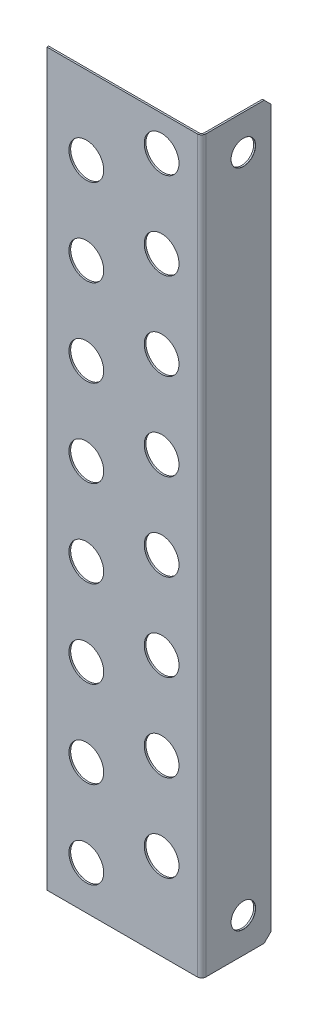
ISO-10303-21;
HEADER;
FILE_DESCRIPTION(('STEP AP214'),'2;1');
FILE_NAME('part.step','',(''),(''),'','','');
FILE_SCHEMA(('AUTOMOTIVE_DESIGN { 1 0 10303 214 1 1 1 1 }'));
ENDSEC;
DATA;
#1=APPLICATION_CONTEXT('core data for automotive mechanical design processes');
#2=APPLICATION_PROTOCOL_DEFINITION('international standard','automotive_design',2000,#1);
#3=PRODUCT_CONTEXT('',#1,'mechanical');
#4=PRODUCT('Part','Part','',(#3));
#5=PRODUCT_RELATED_PRODUCT_CATEGORY('part','',(#4));
#6=PRODUCT_DEFINITION_FORMATION('','',#4);
#7=PRODUCT_DEFINITION_CONTEXT('part definition',#1,'design');
#8=PRODUCT_DEFINITION('design','',#6,#7);
#9=PRODUCT_DEFINITION_SHAPE('','',#8);
#10=(LENGTH_UNIT() NAMED_UNIT(*) SI_UNIT(.MILLI.,.METRE.));
#11=(NAMED_UNIT(*) PLANE_ANGLE_UNIT() SI_UNIT($,.RADIAN.));
#12=(NAMED_UNIT(*) SI_UNIT($,.STERADIAN.) SOLID_ANGLE_UNIT());
#13=UNCERTAINTY_MEASURE_WITH_UNIT(LENGTH_MEASURE(1.E-05),#10,'distance_accuracy_value','');
#14=(GEOMETRIC_REPRESENTATION_CONTEXT(3) GLOBAL_UNCERTAINTY_ASSIGNED_CONTEXT((#13)) GLOBAL_UNIT_ASSIGNED_CONTEXT((#10,
#11,#12)) REPRESENTATION_CONTEXT('',''));
#15=CARTESIAN_POINT('',(0.,0.,0.));
#16=DIRECTION('',(0.,0.,1.));
#17=DIRECTION('',(1.,0.,0.));
#18=AXIS2_PLACEMENT_3D('',#15,#16,#17);
#19=CARTESIAN_POINT('',(22.,-105.,-0.5));
#20=DIRECTION('',(0.,-1.,0.));
#21=DIRECTION('',(1.,0.,0.));
#22=AXIS2_PLACEMENT_3D('',#19,#20,#21);
#23=PLANE('',#22);
#24=DIRECTION('',(1.,0.,0.));
#25=VECTOR('',#24,1.);
#26=CARTESIAN_POINT('',(22.,-105.,-0.5));
#27=LINE('',#26,#25);
#28=CARTESIAN_POINT('',(-22.,-105.,-0.5));
#29=VERTEX_POINT('',#28);
#30=CARTESIAN_POINT('',(21.2634,-105.,-0.500000000000001));
#31=VERTEX_POINT('',#30);
#32=EDGE_CURVE('E213',#29,#31,#27,.T.);
#33=ORIENTED_EDGE('',*,*,#32,.T.);
#34=DIRECTION('',(0.,0.,1.));
#35=VECTOR('',#34,1.);
#36=CARTESIAN_POINT('',(21.2634,-105.,-0.500000000000001));
#37=LINE('',#36,#35);
#38=CARTESIAN_POINT('',(21.2634,-105.,0.));
#39=VERTEX_POINT('',#38);
#40=EDGE_CURVE('E174',#31,#39,#37,.T.);
#41=ORIENTED_EDGE('',*,*,#40,.T.);
#42=DIRECTION('',(1.,0.,0.));
#43=VECTOR('',#42,1.);
#44=CARTESIAN_POINT('',(22.,-105.,0.));
#45=LINE('',#44,#43);
#46=CARTESIAN_POINT('',(-22.,-105.,0.));
#47=VERTEX_POINT('',#46);
#48=EDGE_CURVE('E222',#47,#39,#45,.T.);
#49=ORIENTED_EDGE('',*,*,#48,.F.);
#50=DIRECTION('',(0.,0.,1.));
#51=VECTOR('',#50,1.);
#52=CARTESIAN_POINT('',(-22.,-105.,-0.5));
#53=LINE('',#52,#51);
#54=EDGE_CURVE('E219',#29,#47,#53,.T.);
#55=ORIENTED_EDGE('',*,*,#54,.F.);
#56=EDGE_LOOP('',(#33,#41,#49,#55));
#57=FACE_BOUND('',#56,.T.);
#58=ADVANCED_FACE('F47',(#57),#23,.T.);
#59=CARTESIAN_POINT('',(0.,0.,-0.5));
#60=DIRECTION('',(0.,0.,1.));
#61=DIRECTION('',(1.,0.,0.));
#62=AXIS2_PLACEMENT_3D('',#59,#60,#61);
#63=PLANE('',#62);
#64=CARTESIAN_POINT('',(-10.650635094611,-92.5,-0.5));
#65=DIRECTION('',(0.,0.,1.));
#66=DIRECTION('',(1.,0.,0.));
#67=AXIS2_PLACEMENT_3D('',#64,#65,#66);
#68=CIRCLE('',#67,5.);
#69=CARTESIAN_POINT('',(-5.65063509461096,-92.5,-0.5));
#70=VERTEX_POINT('',#69);
#71=EDGE_CURVE('E299',#70,#70,#68,.T.);
#72=ORIENTED_EDGE('',*,*,#71,.T.);
#73=EDGE_LOOP('',(#72));
#74=FACE_BOUND('',#73,.T.);
#75=CARTESIAN_POINT('',(-10.650635094611,-67.5,-0.5));
#76=DIRECTION('',(0.,0.,1.));
#77=DIRECTION('',(1.,0.,0.));
#78=AXIS2_PLACEMENT_3D('',#75,#76,#77);
#79=CIRCLE('',#78,5.);
#80=CARTESIAN_POINT('',(-5.65063509461096,-67.5,-0.5));
#81=VERTEX_POINT('',#80);
#82=EDGE_CURVE('E293',#81,#81,#79,.T.);
#83=ORIENTED_EDGE('',*,*,#82,.T.);
#84=EDGE_LOOP('',(#83));
#85=FACE_BOUND('',#84,.T.);
#86=CARTESIAN_POINT('',(-10.650635094611,-42.5,-0.5));
#87=DIRECTION('',(0.,0.,1.));
#88=DIRECTION('',(1.,0.,0.));
#89=AXIS2_PLACEMENT_3D('',#86,#87,#88);
#90=CIRCLE('',#89,5.);
#91=CARTESIAN_POINT('',(-5.65063509461096,-42.5,-0.5));
#92=VERTEX_POINT('',#91);
#93=EDGE_CURVE('E287',#92,#92,#90,.T.);
#94=ORIENTED_EDGE('',*,*,#93,.T.);
#95=EDGE_LOOP('',(#94));
#96=FACE_BOUND('',#95,.T.);
#97=CARTESIAN_POINT('',(-10.650635094611,-17.5,-0.5));
#98=DIRECTION('',(0.,0.,1.));
#99=DIRECTION('',(1.,0.,0.));
#100=AXIS2_PLACEMENT_3D('',#97,#98,#99);
#101=CIRCLE('',#100,5.);
#102=CARTESIAN_POINT('',(-5.65063509461096,-17.5,-0.5));
#103=VERTEX_POINT('',#102);
#104=EDGE_CURVE('E281',#103,#103,#101,.T.);
#105=ORIENTED_EDGE('',*,*,#104,.T.);
#106=EDGE_LOOP('',(#105));
#107=FACE_BOUND('',#106,.T.);
#108=CARTESIAN_POINT('',(-10.650635094611,7.50000000000001,-0.5));
#109=DIRECTION('',(0.,0.,1.));
#110=DIRECTION('',(1.,0.,0.));
#111=AXIS2_PLACEMENT_3D('',#108,#109,#110);
#112=CIRCLE('',#111,5.);
#113=CARTESIAN_POINT('',(-5.65063509461096,7.50000000000001,-0.5));
#114=VERTEX_POINT('',#113);
#115=EDGE_CURVE('E275',#114,#114,#112,.T.);
#116=ORIENTED_EDGE('',*,*,#115,.T.);
#117=EDGE_LOOP('',(#116));
#118=FACE_BOUND('',#117,.T.);
#119=CARTESIAN_POINT('',(-10.650635094611,32.5,-0.5));
#120=DIRECTION('',(0.,0.,1.));
#121=DIRECTION('',(1.,0.,0.));
#122=AXIS2_PLACEMENT_3D('',#119,#120,#121);
#123=CIRCLE('',#122,5.);
#124=CARTESIAN_POINT('',(-5.65063509461096,32.5,-0.5));
#125=VERTEX_POINT('',#124);
#126=EDGE_CURVE('E269',#125,#125,#123,.T.);
#127=ORIENTED_EDGE('',*,*,#126,.T.);
#128=EDGE_LOOP('',(#127));
#129=FACE_BOUND('',#128,.T.);
#130=CARTESIAN_POINT('',(11.,-80.,-0.5));
#131=DIRECTION('',(0.,0.,1.));
#132=DIRECTION('',(1.,0.,0.));
#133=AXIS2_PLACEMENT_3D('',#130,#131,#132);
#134=CIRCLE('',#133,5.);
#135=CARTESIAN_POINT('',(16.,-80.,-0.5));
#136=VERTEX_POINT('',#135);
#137=EDGE_CURVE('E263',#136,#136,#134,.T.);
#138=ORIENTED_EDGE('',*,*,#137,.T.);
#139=EDGE_LOOP('',(#138));
#140=FACE_BOUND('',#139,.T.);
#141=CARTESIAN_POINT('',(11.,-55.,-0.5));
#142=DIRECTION('',(0.,0.,1.));
#143=DIRECTION('',(1.,0.,0.));
#144=AXIS2_PLACEMENT_3D('',#141,#142,#143);
#145=CIRCLE('',#144,5.);
#146=CARTESIAN_POINT('',(16.,-55.,-0.5));
#147=VERTEX_POINT('',#146);
#148=EDGE_CURVE('E257',#147,#147,#145,.T.);
#149=ORIENTED_EDGE('',*,*,#148,.T.);
#150=EDGE_LOOP('',(#149));
#151=FACE_BOUND('',#150,.T.);
#152=CARTESIAN_POINT('',(11.,-30.,-0.5));
#153=DIRECTION('',(0.,0.,1.));
#154=DIRECTION('',(1.,0.,0.));
#155=AXIS2_PLACEMENT_3D('',#152,#153,#154);
#156=CIRCLE('',#155,5.);
#157=CARTESIAN_POINT('',(16.,-30.,-0.5));
#158=VERTEX_POINT('',#157);
#159=EDGE_CURVE('E251',#158,#158,#156,.T.);
#160=ORIENTED_EDGE('',*,*,#159,.T.);
#161=EDGE_LOOP('',(#160));
#162=FACE_BOUND('',#161,.T.);
#163=CARTESIAN_POINT('',(11.,-5.,-0.5));
#164=DIRECTION('',(0.,0.,1.));
#165=DIRECTION('',(1.,0.,0.));
#166=AXIS2_PLACEMENT_3D('',#163,#164,#165);
#167=CIRCLE('',#166,5.);
#168=CARTESIAN_POINT('',(16.,-5.,-0.5));
#169=VERTEX_POINT('',#168);
#170=EDGE_CURVE('E245',#169,#169,#167,.T.);
#171=ORIENTED_EDGE('',*,*,#170,.T.);
#172=EDGE_LOOP('',(#171));
#173=FACE_BOUND('',#172,.T.);
#174=CARTESIAN_POINT('',(11.,20.,-0.5));
#175=DIRECTION('',(0.,0.,1.));
#176=DIRECTION('',(1.,0.,0.));
#177=AXIS2_PLACEMENT_3D('',#174,#175,#176);
#178=CIRCLE('',#177,5.);
#179=CARTESIAN_POINT('',(16.,20.,-0.5));
#180=VERTEX_POINT('',#179);
#181=EDGE_CURVE('E239',#180,#180,#178,.T.);
#182=ORIENTED_EDGE('',*,*,#181,.T.);
#183=EDGE_LOOP('',(#182));
#184=FACE_BOUND('',#183,.T.);
#185=CARTESIAN_POINT('',(11.,45.,-0.5));
#186=DIRECTION('',(0.,0.,1.));
#187=DIRECTION('',(1.,0.,0.));
#188=AXIS2_PLACEMENT_3D('',#185,#186,#187);
#189=CIRCLE('',#188,5.);
#190=CARTESIAN_POINT('',(16.,45.,-0.5));
#191=VERTEX_POINT('',#190);
#192=EDGE_CURVE('E233',#191,#191,#189,.T.);
#193=ORIENTED_EDGE('',*,*,#192,.T.);
#194=EDGE_LOOP('',(#193));
#195=FACE_BOUND('',#194,.T.);
#196=CARTESIAN_POINT('',(-10.650635094611,82.5,-0.5));
#197=DIRECTION('',(0.,0.,1.));
#198=DIRECTION('',(1.,0.,0.));
#199=AXIS2_PLACEMENT_3D('',#196,#197,#198);
#200=CIRCLE('',#199,5.);
#201=CARTESIAN_POINT('',(-5.65063509461096,82.5,-0.5));
#202=VERTEX_POINT('',#201);
#203=EDGE_CURVE('E201',#202,#202,#200,.T.);
#204=ORIENTED_EDGE('',*,*,#203,.T.);
#205=EDGE_LOOP('',(#204));
#206=FACE_BOUND('',#205,.T.);
#207=CARTESIAN_POINT('',(11.,95.,-0.5));
#208=DIRECTION('',(0.,0.,1.));
#209=DIRECTION('',(1.,0.,0.));
#210=AXIS2_PLACEMENT_3D('',#207,#208,#209);
#211=CIRCLE('',#210,5.);
#212=CARTESIAN_POINT('',(16.,95.,-0.5));
#213=VERTEX_POINT('',#212);
#214=EDGE_CURVE('E206',#213,#213,#211,.T.);
#215=ORIENTED_EDGE('',*,*,#214,.T.);
#216=EDGE_LOOP('',(#215));
#217=FACE_BOUND('',#216,.T.);
#218=CARTESIAN_POINT('',(11.,70.,-0.5));
#219=DIRECTION('',(0.,0.,1.));
#220=DIRECTION('',(1.,0.,0.));
#221=AXIS2_PLACEMENT_3D('',#218,#219,#220);
#222=CIRCLE('',#221,5.);
#223=CARTESIAN_POINT('',(16.,70.,-0.5));
#224=VERTEX_POINT('',#223);
#225=EDGE_CURVE('E194',#224,#224,#222,.T.);
#226=ORIENTED_EDGE('',*,*,#225,.T.);
#227=EDGE_LOOP('',(#226));
#228=FACE_BOUND('',#227,.T.);
#229=CARTESIAN_POINT('',(-10.650635094611,57.5,-0.5));
#230=DIRECTION('',(0.,0.,1.));
#231=DIRECTION('',(1.,0.,0.));
#232=AXIS2_PLACEMENT_3D('',#229,#230,#231);
#233=CIRCLE('',#232,5.);
#234=CARTESIAN_POINT('',(-5.65063509461096,57.5,-0.5));
#235=VERTEX_POINT('',#234);
#236=EDGE_CURVE('E188',#235,#235,#233,.T.);
#237=ORIENTED_EDGE('',*,*,#236,.T.);
#238=EDGE_LOOP('',(#237));
#239=FACE_BOUND('',#238,.T.);
#240=DIRECTION('',(0.,-1.,0.));
#241=VECTOR('',#240,1.);
#242=CARTESIAN_POINT('',(21.2634,-105.,-0.500000000000001));
#243=LINE('',#242,#241);
#244=CARTESIAN_POINT('',(21.2634,105.,-0.500000000000001));
#245=VERTEX_POINT('',#244);
#246=EDGE_CURVE('E178',#31,#245,#243,.F.);
#247=ORIENTED_EDGE('',*,*,#246,.F.);
#248=ORIENTED_EDGE('',*,*,#32,.F.);
#249=DIRECTION('',(0.,-1.,0.));
#250=VECTOR('',#249,1.);
#251=CARTESIAN_POINT('',(-22.,-105.,-0.5));
#252=LINE('',#251,#250);
#253=CARTESIAN_POINT('',(-22.,105.,-0.5));
#254=VERTEX_POINT('',#253);
#255=EDGE_CURVE('E210',#254,#29,#252,.T.);
#256=ORIENTED_EDGE('',*,*,#255,.F.);
#257=DIRECTION('',(-1.,0.,0.));
#258=VECTOR('',#257,1.);
#259=CARTESIAN_POINT('',(22.,105.,-0.5));
#260=LINE('',#259,#258);
#261=EDGE_CURVE('E217',#245,#254,#260,.T.);
#262=ORIENTED_EDGE('',*,*,#261,.F.);
#263=EDGE_LOOP('',(#247,#248,#256,#262));
#264=FACE_BOUND('',#263,.T.);
#265=ADVANCED_FACE('F369',(#74,#85,#96,#107,#118,#129,#140,#151,#162,#173,#184,#195,#206,#217,
#228,#239,#264),#63,.F.);
#266=CARTESIAN_POINT('',(0.,0.,0.));
#267=DIRECTION('',(0.,0.,1.));
#268=DIRECTION('',(1.,0.,0.));
#269=AXIS2_PLACEMENT_3D('',#266,#267,#268);
#270=PLANE('',#269);
#271=CARTESIAN_POINT('',(-10.650635094611,57.5,0.));
#272=DIRECTION('',(0.,0.,1.));
#273=DIRECTION('',(1.,0.,0.));
#274=AXIS2_PLACEMENT_3D('',#271,#272,#273);
#275=CIRCLE('',#274,5.);
#276=CARTESIAN_POINT('',(-5.65063509461096,57.5,0.));
#277=VERTEX_POINT('',#276);
#278=EDGE_CURVE('E184',#277,#277,#275,.T.);
#279=ORIENTED_EDGE('',*,*,#278,.F.);
#280=EDGE_LOOP('',(#279));
#281=FACE_BOUND('',#280,.T.);
#282=CARTESIAN_POINT('',(11.,70.,0.));
#283=DIRECTION('',(0.,0.,1.));
#284=DIRECTION('',(1.,0.,0.));
#285=AXIS2_PLACEMENT_3D('',#282,#283,#284);
#286=CIRCLE('',#285,5.);
#287=CARTESIAN_POINT('',(16.,70.,0.));
#288=VERTEX_POINT('',#287);
#289=EDGE_CURVE('E191',#288,#288,#286,.T.);
#290=ORIENTED_EDGE('',*,*,#289,.F.);
#291=EDGE_LOOP('',(#290));
#292=FACE_BOUND('',#291,.T.);
#293=CARTESIAN_POINT('',(11.,95.,0.));
#294=DIRECTION('',(0.,0.,1.));
#295=DIRECTION('',(1.,0.,0.));
#296=AXIS2_PLACEMENT_3D('',#293,#294,#295);
#297=CIRCLE('',#296,5.);
#298=CARTESIAN_POINT('',(16.,95.,0.));
#299=VERTEX_POINT('',#298);
#300=EDGE_CURVE('E198',#299,#299,#297,.T.);
#301=ORIENTED_EDGE('',*,*,#300,.F.);
#302=EDGE_LOOP('',(#301));
#303=FACE_BOUND('',#302,.T.);
#304=CARTESIAN_POINT('',(-10.650635094611,82.5,0.));
#305=DIRECTION('',(0.,0.,1.));
#306=DIRECTION('',(1.,0.,0.));
#307=AXIS2_PLACEMENT_3D('',#304,#305,#306);
#308=CIRCLE('',#307,5.);
#309=CARTESIAN_POINT('',(-5.65063509461096,82.5,0.));
#310=VERTEX_POINT('',#309);
#311=EDGE_CURVE('E197',#310,#310,#308,.T.);
#312=ORIENTED_EDGE('',*,*,#311,.F.);
#313=EDGE_LOOP('',(#312));
#314=FACE_BOUND('',#313,.T.);
#315=CARTESIAN_POINT('',(11.,45.,0.));
#316=DIRECTION('',(0.,0.,1.));
#317=DIRECTION('',(1.,0.,0.));
#318=AXIS2_PLACEMENT_3D('',#315,#316,#317);
#319=CIRCLE('',#318,5.);
#320=CARTESIAN_POINT('',(16.,45.,0.));
#321=VERTEX_POINT('',#320);
#322=EDGE_CURVE('E229',#321,#321,#319,.T.);
#323=ORIENTED_EDGE('',*,*,#322,.F.);
#324=EDGE_LOOP('',(#323));
#325=FACE_BOUND('',#324,.T.);
#326=CARTESIAN_POINT('',(11.,20.,0.));
#327=DIRECTION('',(0.,0.,1.));
#328=DIRECTION('',(1.,0.,0.));
#329=AXIS2_PLACEMENT_3D('',#326,#327,#328);
#330=CIRCLE('',#329,5.);
#331=CARTESIAN_POINT('',(16.,20.,0.));
#332=VERTEX_POINT('',#331);
#333=EDGE_CURVE('E236',#332,#332,#330,.T.);
#334=ORIENTED_EDGE('',*,*,#333,.F.);
#335=EDGE_LOOP('',(#334));
#336=FACE_BOUND('',#335,.T.);
#337=CARTESIAN_POINT('',(11.,-5.,0.));
#338=DIRECTION('',(0.,0.,1.));
#339=DIRECTION('',(1.,0.,0.));
#340=AXIS2_PLACEMENT_3D('',#337,#338,#339);
#341=CIRCLE('',#340,5.);
#342=CARTESIAN_POINT('',(16.,-5.,0.));
#343=VERTEX_POINT('',#342);
#344=EDGE_CURVE('E242',#343,#343,#341,.T.);
#345=ORIENTED_EDGE('',*,*,#344,.F.);
#346=EDGE_LOOP('',(#345));
#347=FACE_BOUND('',#346,.T.);
#348=CARTESIAN_POINT('',(11.,-30.,0.));
#349=DIRECTION('',(0.,0.,1.));
#350=DIRECTION('',(1.,0.,0.));
#351=AXIS2_PLACEMENT_3D('',#348,#349,#350);
#352=CIRCLE('',#351,5.);
#353=CARTESIAN_POINT('',(16.,-30.,0.));
#354=VERTEX_POINT('',#353);
#355=EDGE_CURVE('E248',#354,#354,#352,.T.);
#356=ORIENTED_EDGE('',*,*,#355,.F.);
#357=EDGE_LOOP('',(#356));
#358=FACE_BOUND('',#357,.T.);
#359=CARTESIAN_POINT('',(11.,-55.,0.));
#360=DIRECTION('',(0.,0.,1.));
#361=DIRECTION('',(1.,0.,0.));
#362=AXIS2_PLACEMENT_3D('',#359,#360,#361);
#363=CIRCLE('',#362,5.);
#364=CARTESIAN_POINT('',(16.,-55.,0.));
#365=VERTEX_POINT('',#364);
#366=EDGE_CURVE('E254',#365,#365,#363,.T.);
#367=ORIENTED_EDGE('',*,*,#366,.F.);
#368=EDGE_LOOP('',(#367));
#369=FACE_BOUND('',#368,.T.);
#370=CARTESIAN_POINT('',(11.,-80.,0.));
#371=DIRECTION('',(0.,0.,1.));
#372=DIRECTION('',(1.,0.,0.));
#373=AXIS2_PLACEMENT_3D('',#370,#371,#372);
#374=CIRCLE('',#373,5.);
#375=CARTESIAN_POINT('',(16.,-80.,0.));
#376=VERTEX_POINT('',#375);
#377=EDGE_CURVE('E260',#376,#376,#374,.T.);
#378=ORIENTED_EDGE('',*,*,#377,.F.);
#379=EDGE_LOOP('',(#378));
#380=FACE_BOUND('',#379,.T.);
#381=CARTESIAN_POINT('',(-10.650635094611,32.5,0.));
#382=DIRECTION('',(0.,0.,1.));
#383=DIRECTION('',(1.,0.,0.));
#384=AXIS2_PLACEMENT_3D('',#381,#382,#383);
#385=CIRCLE('',#384,5.);
#386=CARTESIAN_POINT('',(-5.65063509461096,32.5,0.));
#387=VERTEX_POINT('',#386);
#388=EDGE_CURVE('E266',#387,#387,#385,.T.);
#389=ORIENTED_EDGE('',*,*,#388,.F.);
#390=EDGE_LOOP('',(#389));
#391=FACE_BOUND('',#390,.T.);
#392=CARTESIAN_POINT('',(-10.650635094611,7.50000000000001,0.));
#393=DIRECTION('',(0.,0.,1.));
#394=DIRECTION('',(1.,0.,0.));
#395=AXIS2_PLACEMENT_3D('',#392,#393,#394);
#396=CIRCLE('',#395,5.);
#397=CARTESIAN_POINT('',(-5.65063509461096,7.50000000000001,0.));
#398=VERTEX_POINT('',#397);
#399=EDGE_CURVE('E272',#398,#398,#396,.T.);
#400=ORIENTED_EDGE('',*,*,#399,.F.);
#401=EDGE_LOOP('',(#400));
#402=FACE_BOUND('',#401,.T.);
#403=CARTESIAN_POINT('',(-10.650635094611,-17.5,0.));
#404=DIRECTION('',(0.,0.,1.));
#405=DIRECTION('',(1.,0.,0.));
#406=AXIS2_PLACEMENT_3D('',#403,#404,#405);
#407=CIRCLE('',#406,5.);
#408=CARTESIAN_POINT('',(-5.65063509461096,-17.5,0.));
#409=VERTEX_POINT('',#408);
#410=EDGE_CURVE('E278',#409,#409,#407,.T.);
#411=ORIENTED_EDGE('',*,*,#410,.F.);
#412=EDGE_LOOP('',(#411));
#413=FACE_BOUND('',#412,.T.);
#414=CARTESIAN_POINT('',(-10.650635094611,-42.5,0.));
#415=DIRECTION('',(0.,0.,1.));
#416=DIRECTION('',(1.,0.,0.));
#417=AXIS2_PLACEMENT_3D('',#414,#415,#416);
#418=CIRCLE('',#417,5.);
#419=CARTESIAN_POINT('',(-5.65063509461096,-42.5,0.));
#420=VERTEX_POINT('',#419);
#421=EDGE_CURVE('E284',#420,#420,#418,.T.);
#422=ORIENTED_EDGE('',*,*,#421,.F.);
#423=EDGE_LOOP('',(#422));
#424=FACE_BOUND('',#423,.T.);
#425=CARTESIAN_POINT('',(-10.650635094611,-67.5,0.));
#426=DIRECTION('',(0.,0.,1.));
#427=DIRECTION('',(1.,0.,0.));
#428=AXIS2_PLACEMENT_3D('',#425,#426,#427);
#429=CIRCLE('',#428,5.);
#430=CARTESIAN_POINT('',(-5.65063509461096,-67.5,0.));
#431=VERTEX_POINT('',#430);
#432=EDGE_CURVE('E290',#431,#431,#429,.T.);
#433=ORIENTED_EDGE('',*,*,#432,.F.);
#434=EDGE_LOOP('',(#433));
#435=FACE_BOUND('',#434,.T.);
#436=CARTESIAN_POINT('',(-10.650635094611,-92.5,0.));
#437=DIRECTION('',(0.,0.,1.));
#438=DIRECTION('',(1.,0.,0.));
#439=AXIS2_PLACEMENT_3D('',#436,#437,#438);
#440=CIRCLE('',#439,5.);
#441=CARTESIAN_POINT('',(-5.65063509461096,-92.5,0.));
#442=VERTEX_POINT('',#441);
#443=EDGE_CURVE('E296',#442,#442,#440,.T.);
#444=ORIENTED_EDGE('',*,*,#443,.F.);
#445=EDGE_LOOP('',(#444));
#446=FACE_BOUND('',#445,.T.);
#447=ORIENTED_EDGE('',*,*,#48,.T.);
#448=DIRECTION('',(0.,-1.,0.));
#449=VECTOR('',#448,1.);
#450=CARTESIAN_POINT('',(21.2634,-105.,0.));
#451=LINE('',#450,#449);
#452=CARTESIAN_POINT('',(21.2634,105.,0.));
#453=VERTEX_POINT('',#452);
#454=EDGE_CURVE('E132',#39,#453,#451,.F.);
#455=ORIENTED_EDGE('',*,*,#454,.T.);
#456=DIRECTION('',(-1.,0.,0.));
#457=VECTOR('',#456,1.);
#458=CARTESIAN_POINT('',(22.,105.,0.));
#459=LINE('',#458,#457);
#460=CARTESIAN_POINT('',(-22.,105.,0.));
#461=VERTEX_POINT('',#460);
#462=EDGE_CURVE('E214',#453,#461,#459,.T.);
#463=ORIENTED_EDGE('',*,*,#462,.T.);
#464=DIRECTION('',(0.,-1.,0.));
#465=VECTOR('',#464,1.);
#466=CARTESIAN_POINT('',(-22.,-105.,0.));
#467=LINE('',#466,#465);
#468=EDGE_CURVE('E209',#461,#47,#467,.T.);
#469=ORIENTED_EDGE('',*,*,#468,.T.);
#470=EDGE_LOOP('',(#447,#455,#463,#469));
#471=FACE_BOUND('',#470,.T.);
#472=ADVANCED_FACE('F376',(#281,#292,#303,#314,#325,#336,#347,#358,#369,#380,#391,#402,#413,
#424,#435,#446,#471),#270,.T.);
#473=CARTESIAN_POINT('',(-10.650635094611,-92.5,-10.));
#474=DIRECTION('',(0.,0.,1.));
#475=DIRECTION('',(1.,0.,0.));
#476=AXIS2_PLACEMENT_3D('',#473,#474,#475);
#477=CYLINDRICAL_SURFACE('',#476,5.);
#478=ORIENTED_EDGE('',*,*,#443,.T.);
#479=EDGE_LOOP('',(#478));
#480=FACE_BOUND('',#479,.T.);
#481=ORIENTED_EDGE('',*,*,#71,.F.);
#482=EDGE_LOOP('',(#481));
#483=FACE_BOUND('',#482,.T.);
#484=ADVANCED_FACE('F430',(#480,#483),#477,.F.);
#485=CARTESIAN_POINT('',(-10.650635094611,-67.5,-10.));
#486=DIRECTION('',(0.,0.,1.));
#487=DIRECTION('',(1.,0.,0.));
#488=AXIS2_PLACEMENT_3D('',#485,#486,#487);
#489=CYLINDRICAL_SURFACE('',#488,5.);
#490=ORIENTED_EDGE('',*,*,#432,.T.);
#491=EDGE_LOOP('',(#490));
#492=FACE_BOUND('',#491,.T.);
#493=ORIENTED_EDGE('',*,*,#82,.F.);
#494=EDGE_LOOP('',(#493));
#495=FACE_BOUND('',#494,.T.);
#496=ADVANCED_FACE('F426',(#492,#495),#489,.F.);
#497=CARTESIAN_POINT('',(-10.650635094611,-42.5,-10.));
#498=DIRECTION('',(0.,0.,1.));
#499=DIRECTION('',(1.,0.,0.));
#500=AXIS2_PLACEMENT_3D('',#497,#498,#499);
#501=CYLINDRICAL_SURFACE('',#500,5.);
#502=ORIENTED_EDGE('',*,*,#421,.T.);
#503=EDGE_LOOP('',(#502));
#504=FACE_BOUND('',#503,.T.);
#505=ORIENTED_EDGE('',*,*,#93,.F.);
#506=EDGE_LOOP('',(#505));
#507=FACE_BOUND('',#506,.T.);
#508=ADVANCED_FACE('F422',(#504,#507),#501,.F.);
#509=CARTESIAN_POINT('',(-10.650635094611,-17.5,-10.));
#510=DIRECTION('',(0.,0.,1.));
#511=DIRECTION('',(1.,0.,0.));
#512=AXIS2_PLACEMENT_3D('',#509,#510,#511);
#513=CYLINDRICAL_SURFACE('',#512,5.);
#514=ORIENTED_EDGE('',*,*,#410,.T.);
#515=EDGE_LOOP('',(#514));
#516=FACE_BOUND('',#515,.T.);
#517=ORIENTED_EDGE('',*,*,#104,.F.);
#518=EDGE_LOOP('',(#517));
#519=FACE_BOUND('',#518,.T.);
#520=ADVANCED_FACE('F418',(#516,#519),#513,.F.);
#521=CARTESIAN_POINT('',(-10.650635094611,7.50000000000001,-10.));
#522=DIRECTION('',(0.,0.,1.));
#523=DIRECTION('',(1.,0.,0.));
#524=AXIS2_PLACEMENT_3D('',#521,#522,#523);
#525=CYLINDRICAL_SURFACE('',#524,5.);
#526=ORIENTED_EDGE('',*,*,#399,.T.);
#527=EDGE_LOOP('',(#526));
#528=FACE_BOUND('',#527,.T.);
#529=ORIENTED_EDGE('',*,*,#115,.F.);
#530=EDGE_LOOP('',(#529));
#531=FACE_BOUND('',#530,.T.);
#532=ADVANCED_FACE('F414',(#528,#531),#525,.F.);
#533=CARTESIAN_POINT('',(-10.650635094611,32.5,-10.));
#534=DIRECTION('',(0.,0.,1.));
#535=DIRECTION('',(1.,0.,0.));
#536=AXIS2_PLACEMENT_3D('',#533,#534,#535);
#537=CYLINDRICAL_SURFACE('',#536,5.);
#538=ORIENTED_EDGE('',*,*,#388,.T.);
#539=EDGE_LOOP('',(#538));
#540=FACE_BOUND('',#539,.T.);
#541=ORIENTED_EDGE('',*,*,#126,.F.);
#542=EDGE_LOOP('',(#541));
#543=FACE_BOUND('',#542,.T.);
#544=ADVANCED_FACE('F410',(#540,#543),#537,.F.);
#545=CARTESIAN_POINT('',(11.,-80.,-10.));
#546=DIRECTION('',(0.,0.,1.));
#547=DIRECTION('',(1.,0.,0.));
#548=AXIS2_PLACEMENT_3D('',#545,#546,#547);
#549=CYLINDRICAL_SURFACE('',#548,5.);
#550=ORIENTED_EDGE('',*,*,#377,.T.);
#551=EDGE_LOOP('',(#550));
#552=FACE_BOUND('',#551,.T.);
#553=ORIENTED_EDGE('',*,*,#137,.F.);
#554=EDGE_LOOP('',(#553));
#555=FACE_BOUND('',#554,.T.);
#556=ADVANCED_FACE('F406',(#552,#555),#549,.F.);
#557=CARTESIAN_POINT('',(11.,-55.,-10.));
#558=DIRECTION('',(0.,0.,1.));
#559=DIRECTION('',(1.,0.,0.));
#560=AXIS2_PLACEMENT_3D('',#557,#558,#559);
#561=CYLINDRICAL_SURFACE('',#560,5.);
#562=ORIENTED_EDGE('',*,*,#366,.T.);
#563=EDGE_LOOP('',(#562));
#564=FACE_BOUND('',#563,.T.);
#565=ORIENTED_EDGE('',*,*,#148,.F.);
#566=EDGE_LOOP('',(#565));
#567=FACE_BOUND('',#566,.T.);
#568=ADVANCED_FACE('F402',(#564,#567),#561,.F.);
#569=CARTESIAN_POINT('',(11.,-30.,-10.));
#570=DIRECTION('',(0.,0.,1.));
#571=DIRECTION('',(1.,0.,0.));
#572=AXIS2_PLACEMENT_3D('',#569,#570,#571);
#573=CYLINDRICAL_SURFACE('',#572,5.);
#574=ORIENTED_EDGE('',*,*,#355,.T.);
#575=EDGE_LOOP('',(#574));
#576=FACE_BOUND('',#575,.T.);
#577=ORIENTED_EDGE('',*,*,#159,.F.);
#578=EDGE_LOOP('',(#577));
#579=FACE_BOUND('',#578,.T.);
#580=ADVANCED_FACE('F398',(#576,#579),#573,.F.);
#581=CARTESIAN_POINT('',(11.,-5.,-10.));
#582=DIRECTION('',(0.,0.,1.));
#583=DIRECTION('',(1.,0.,0.));
#584=AXIS2_PLACEMENT_3D('',#581,#582,#583);
#585=CYLINDRICAL_SURFACE('',#584,5.);
#586=ORIENTED_EDGE('',*,*,#344,.T.);
#587=EDGE_LOOP('',(#586));
#588=FACE_BOUND('',#587,.T.);
#589=ORIENTED_EDGE('',*,*,#170,.F.);
#590=EDGE_LOOP('',(#589));
#591=FACE_BOUND('',#590,.T.);
#592=ADVANCED_FACE('F394',(#588,#591),#585,.F.);
#593=CARTESIAN_POINT('',(11.,20.,-10.));
#594=DIRECTION('',(0.,0.,1.));
#595=DIRECTION('',(1.,0.,0.));
#596=AXIS2_PLACEMENT_3D('',#593,#594,#595);
#597=CYLINDRICAL_SURFACE('',#596,5.);
#598=ORIENTED_EDGE('',*,*,#333,.T.);
#599=EDGE_LOOP('',(#598));
#600=FACE_BOUND('',#599,.T.);
#601=ORIENTED_EDGE('',*,*,#181,.F.);
#602=EDGE_LOOP('',(#601));
#603=FACE_BOUND('',#602,.T.);
#604=ADVANCED_FACE('F390',(#600,#603),#597,.F.);
#605=CARTESIAN_POINT('',(11.,45.,-10.));
#606=DIRECTION('',(0.,0.,1.));
#607=DIRECTION('',(1.,0.,0.));
#608=AXIS2_PLACEMENT_3D('',#605,#606,#607);
#609=CYLINDRICAL_SURFACE('',#608,5.);
#610=ORIENTED_EDGE('',*,*,#322,.T.);
#611=EDGE_LOOP('',(#610));
#612=FACE_BOUND('',#611,.T.);
#613=ORIENTED_EDGE('',*,*,#192,.F.);
#614=EDGE_LOOP('',(#613));
#615=FACE_BOUND('',#614,.T.);
#616=ADVANCED_FACE('F386',(#612,#615),#609,.F.);
#617=CARTESIAN_POINT('',(-22.,-105.,-0.5));
#618=DIRECTION('',(-1.,0.,0.));
#619=DIRECTION('',(0.,0.,1.));
#620=AXIS2_PLACEMENT_3D('',#617,#618,#619);
#621=PLANE('',#620);
#622=ORIENTED_EDGE('',*,*,#468,.F.);
#623=DIRECTION('',(0.,0.,1.));
#624=VECTOR('',#623,1.);
#625=CARTESIAN_POINT('',(-22.,105.,-0.5));
#626=LINE('',#625,#624);
#627=EDGE_CURVE('E226',#254,#461,#626,.T.);
#628=ORIENTED_EDGE('',*,*,#627,.F.);
#629=ORIENTED_EDGE('',*,*,#255,.T.);
#630=ORIENTED_EDGE('',*,*,#54,.T.);
#631=EDGE_LOOP('',(#622,#628,#629,#630));
#632=FACE_BOUND('',#631,.T.);
#633=ADVANCED_FACE('F383',(#632),#621,.T.);
#634=CARTESIAN_POINT('',(22.,105.,-0.5));
#635=DIRECTION('',(0.,1.,0.));
#636=DIRECTION('',(0.,0.,1.));
#637=AXIS2_PLACEMENT_3D('',#634,#635,#636);
#638=PLANE('',#637);
#639=DIRECTION('',(0.,0.,1.));
#640=VECTOR('',#639,1.);
#641=CARTESIAN_POINT('',(21.2634,105.,-0.500000000000001));
#642=LINE('',#641,#640);
#643=EDGE_CURVE('E181',#245,#453,#642,.T.);
#644=ORIENTED_EDGE('',*,*,#643,.F.);
#645=ORIENTED_EDGE('',*,*,#261,.T.);
#646=ORIENTED_EDGE('',*,*,#627,.T.);
#647=ORIENTED_EDGE('',*,*,#462,.F.);
#648=EDGE_LOOP('',(#644,#645,#646,#647));
#649=FACE_BOUND('',#648,.T.);
#650=ADVANCED_FACE('F381',(#649),#638,.T.);
#651=CARTESIAN_POINT('',(-10.650635094611,82.5,-10.));
#652=DIRECTION('',(0.,0.,1.));
#653=DIRECTION('',(1.,0.,0.));
#654=AXIS2_PLACEMENT_3D('',#651,#652,#653);
#655=CYLINDRICAL_SURFACE('',#654,5.);
#656=ORIENTED_EDGE('',*,*,#311,.T.);
#657=EDGE_LOOP('',(#656));
#658=FACE_BOUND('',#657,.T.);
#659=ORIENTED_EDGE('',*,*,#203,.F.);
#660=EDGE_LOOP('',(#659));
#661=FACE_BOUND('',#660,.T.);
#662=ADVANCED_FACE('F479',(#658,#661),#655,.F.);
#663=CARTESIAN_POINT('',(11.,95.,-10.));
#664=DIRECTION('',(0.,0.,1.));
#665=DIRECTION('',(1.,0.,0.));
#666=AXIS2_PLACEMENT_3D('',#663,#664,#665);
#667=CYLINDRICAL_SURFACE('',#666,5.);
#668=ORIENTED_EDGE('',*,*,#300,.T.);
#669=EDGE_LOOP('',(#668));
#670=FACE_BOUND('',#669,.T.);
#671=ORIENTED_EDGE('',*,*,#214,.F.);
#672=EDGE_LOOP('',(#671));
#673=FACE_BOUND('',#672,.T.);
#674=ADVANCED_FACE('F475',(#670,#673),#667,.F.);
#675=CARTESIAN_POINT('',(11.,70.,-10.));
#676=DIRECTION('',(0.,0.,1.));
#677=DIRECTION('',(1.,0.,0.));
#678=AXIS2_PLACEMENT_3D('',#675,#676,#677);
#679=CYLINDRICAL_SURFACE('',#678,5.);
#680=ORIENTED_EDGE('',*,*,#289,.T.);
#681=EDGE_LOOP('',(#680));
#682=FACE_BOUND('',#681,.T.);
#683=ORIENTED_EDGE('',*,*,#225,.F.);
#684=EDGE_LOOP('',(#683));
#685=FACE_BOUND('',#684,.T.);
#686=ADVANCED_FACE('F471',(#682,#685),#679,.F.);
#687=CARTESIAN_POINT('',(-10.650635094611,57.5,-10.));
#688=DIRECTION('',(0.,0.,1.));
#689=DIRECTION('',(1.,0.,0.));
#690=AXIS2_PLACEMENT_3D('',#687,#688,#689);
#691=CYLINDRICAL_SURFACE('',#690,5.);
#692=ORIENTED_EDGE('',*,*,#278,.T.);
#693=EDGE_LOOP('',(#692));
#694=FACE_BOUND('',#693,.T.);
#695=ORIENTED_EDGE('',*,*,#236,.F.);
#696=EDGE_LOOP('',(#695));
#697=FACE_BOUND('',#696,.T.);
#698=ADVANCED_FACE('F466',(#694,#697),#691,.F.);
#699=CARTESIAN_POINT('',(21.2634,105.,-1.2366));
#700=DIRECTION('',(0.,1.,0.));
#701=DIRECTION('',(0.,0.,1.));
#702=AXIS2_PLACEMENT_3D('',#699,#700,#701);
#703=PLANE('',#702);
#704=DIRECTION('',(1.,0.,0.));
#705=VECTOR('',#704,1.);
#706=CARTESIAN_POINT('',(22.,105.,-1.2366));
#707=LINE('',#706,#705);
#708=CARTESIAN_POINT('',(22.,105.,-1.2366));
#709=VERTEX_POINT('',#708);
#710=CARTESIAN_POINT('',(22.5,105.,-1.2366));
#711=VERTEX_POINT('',#710);
#712=EDGE_CURVE('E306',#709,#711,#707,.T.);
#713=ORIENTED_EDGE('',*,*,#712,.F.);
#714=CARTESIAN_POINT('',(21.2634,105.,-1.2366));
#715=DIRECTION('',(0.,-1.,0.));
#716=DIRECTION('',(0.,0.,-1.));
#717=AXIS2_PLACEMENT_3D('',#714,#715,#716);
#718=CIRCLE('',#717,0.7366);
#719=EDGE_CURVE('E135',#245,#709,#718,.F.);
#720=ORIENTED_EDGE('',*,*,#719,.F.);
#721=ORIENTED_EDGE('',*,*,#643,.T.);
#722=CARTESIAN_POINT('',(21.2634,105.,-1.2366));
#723=DIRECTION('',(0.,-1.,0.));
#724=DIRECTION('',(0.,0.,-1.));
#725=AXIS2_PLACEMENT_3D('',#722,#723,#724);
#726=CIRCLE('',#725,1.2366);
#727=EDGE_CURVE('E173',#453,#711,#726,.F.);
#728=ORIENTED_EDGE('',*,*,#727,.T.);
#729=EDGE_LOOP('',(#713,#720,#721,#728));
#730=FACE_BOUND('',#729,.T.);
#731=ADVANCED_FACE('F463',(#730),#703,.T.);
#732=CARTESIAN_POINT('',(21.2634,-105.,-1.2366));
#733=DIRECTION('',(0.,1.,0.));
#734=DIRECTION('',(0.,0.,1.));
#735=AXIS2_PLACEMENT_3D('',#732,#733,#734);
#736=PLANE('',#735);
#737=CARTESIAN_POINT('',(21.2634,-105.,-1.2366));
#738=DIRECTION('',(0.,-1.,0.));
#739=DIRECTION('',(0.,0.,-1.));
#740=AXIS2_PLACEMENT_3D('',#737,#738,#739);
#741=CIRCLE('',#740,0.7366);
#742=CARTESIAN_POINT('',(22.,-105.,-1.2366));
#743=VERTEX_POINT('',#742);
#744=EDGE_CURVE('E142',#743,#31,#741,.T.);
#745=ORIENTED_EDGE('',*,*,#744,.F.);
#746=DIRECTION('',(1.,0.,0.));
#747=VECTOR('',#746,1.);
#748=CARTESIAN_POINT('',(22.,-105.,-1.2366));
#749=LINE('',#748,#747);
#750=CARTESIAN_POINT('',(22.5,-105.,-1.2366));
#751=VERTEX_POINT('',#750);
#752=EDGE_CURVE('E139',#743,#751,#749,.T.);
#753=ORIENTED_EDGE('',*,*,#752,.T.);
#754=CARTESIAN_POINT('',(21.2634,-105.,-1.2366));
#755=DIRECTION('',(0.,-1.,0.));
#756=DIRECTION('',(0.,0.,-1.));
#757=AXIS2_PLACEMENT_3D('',#754,#755,#756);
#758=CIRCLE('',#757,1.2366);
#759=EDGE_CURVE('E125',#751,#39,#758,.T.);
#760=ORIENTED_EDGE('',*,*,#759,.T.);
#761=ORIENTED_EDGE('',*,*,#40,.F.);
#762=EDGE_LOOP('',(#745,#753,#760,#761));
#763=FACE_BOUND('',#762,.T.);
#764=ADVANCED_FACE('F140',(#763),#736,.F.);
#765=CARTESIAN_POINT('',(21.2634,-105.,-1.2366));
#766=DIRECTION('',(0.,-1.,0.));
#767=DIRECTION('',(1.,0.,0.));
#768=AXIS2_PLACEMENT_3D('',#765,#766,#767);
#769=CYLINDRICAL_SURFACE('',#768,1.2366);
#770=ORIENTED_EDGE('',*,*,#454,.F.);
#771=ORIENTED_EDGE('',*,*,#759,.F.);
#772=DIRECTION('',(0.,1.,0.));
#773=VECTOR('',#772,1.);
#774=CARTESIAN_POINT('',(22.5,0.,-1.2366));
#775=LINE('',#774,#773);
#776=EDGE_CURVE('E129',#751,#711,#775,.T.);
#777=ORIENTED_EDGE('',*,*,#776,.T.);
#778=ORIENTED_EDGE('',*,*,#727,.F.);
#779=EDGE_LOOP('',(#770,#771,#777,#778));
#780=FACE_BOUND('',#779,.T.);
#781=ADVANCED_FACE('F127',(#780),#769,.T.);
#782=CARTESIAN_POINT('',(21.2634,-105.,-1.2366));
#783=DIRECTION('',(0.,-1.,0.));
#784=DIRECTION('',(1.,0.,0.));
#785=AXIS2_PLACEMENT_3D('',#782,#783,#784);
#786=CYLINDRICAL_SURFACE('',#785,0.7366);
#787=ORIENTED_EDGE('',*,*,#246,.T.);
#788=ORIENTED_EDGE('',*,*,#719,.T.);
#789=DIRECTION('',(0.,-1.,0.));
#790=VECTOR('',#789,1.);
#791=CARTESIAN_POINT('',(22.,105.,-1.2366));
#792=LINE('',#791,#790);
#793=EDGE_CURVE('E147',#709,#743,#792,.T.);
#794=ORIENTED_EDGE('',*,*,#793,.T.);
#795=ORIENTED_EDGE('',*,*,#744,.T.);
#796=EDGE_LOOP('',(#787,#788,#794,#795));
#797=FACE_BOUND('',#796,.T.);
#798=ADVANCED_FACE('F458',(#797),#786,.F.);
#799=CARTESIAN_POINT('',(22.5000000000001,-105.,-20.));
#800=DIRECTION('',(0.,1.,0.));
#801=DIRECTION('',(0.,0.,1.));
#802=AXIS2_PLACEMENT_3D('',#799,#800,#801);
#803=PLANE('',#802);
#804=DIRECTION('',(0.,0.,-1.));
#805=VECTOR('',#804,1.);
#806=CARTESIAN_POINT('',(22.0000000000001,-105.,-20.));
#807=LINE('',#806,#805);
#808=CARTESIAN_POINT('',(22.0000000000001,-105.,-18.));
#809=VERTEX_POINT('',#808);
#810=EDGE_CURVE('E156',#743,#809,#807,.T.);
#811=ORIENTED_EDGE('',*,*,#810,.T.);
#812=DIRECTION('',(1.,0.,0.));
#813=VECTOR('',#812,1.);
#814=CARTESIAN_POINT('',(22.5000000000001,-105.,-18.));
#815=LINE('',#814,#813);
#816=CARTESIAN_POINT('',(22.5000000000001,-105.,-18.));
#817=VERTEX_POINT('',#816);
#818=EDGE_CURVE('E160',#809,#817,#815,.T.);
#819=ORIENTED_EDGE('',*,*,#818,.T.);
#820=DIRECTION('',(0.,0.,-1.));
#821=VECTOR('',#820,1.);
#822=CARTESIAN_POINT('',(22.5000000000001,-105.,-20.));
#823=LINE('',#822,#821);
#824=EDGE_CURVE('E152',#751,#817,#823,.T.);
#825=ORIENTED_EDGE('',*,*,#824,.F.);
#826=ORIENTED_EDGE('',*,*,#752,.F.);
#827=EDGE_LOOP('',(#811,#819,#825,#826));
#828=FACE_BOUND('',#827,.T.);
#829=ADVANCED_FACE('F158',(#828),#803,.F.);
#830=CARTESIAN_POINT('',(22.5,105.,-0.499999999999998));
#831=DIRECTION('',(0.,-1.,0.));
#832=DIRECTION('',(0.,0.,-1.));
#833=AXIS2_PLACEMENT_3D('',#830,#831,#832);
#834=PLANE('',#833);
#835=DIRECTION('',(0.,0.,1.));
#836=VECTOR('',#835,1.);
#837=CARTESIAN_POINT('',(22.5,105.,-0.499999999999998));
#838=LINE('',#837,#836);
#839=CARTESIAN_POINT('',(22.5000000000001,105.,-18.));
#840=VERTEX_POINT('',#839);
#841=EDGE_CURVE('E155',#840,#711,#838,.T.);
#842=ORIENTED_EDGE('',*,*,#841,.F.);
#843=DIRECTION('',(-1.,0.,0.));
#844=VECTOR('',#843,1.);
#845=CARTESIAN_POINT('',(22.5000000000001,105.,-18.));
#846=LINE('',#845,#844);
#847=CARTESIAN_POINT('',(22.0000000000001,105.,-18.));
#848=VERTEX_POINT('',#847);
#849=EDGE_CURVE('E320',#840,#848,#846,.T.);
#850=ORIENTED_EDGE('',*,*,#849,.T.);
#851=DIRECTION('',(0.,0.,1.));
#852=VECTOR('',#851,1.);
#853=CARTESIAN_POINT('',(22.,105.,-0.5));
#854=LINE('',#853,#852);
#855=EDGE_CURVE('E162',#848,#709,#854,.T.);
#856=ORIENTED_EDGE('',*,*,#855,.T.);
#857=ORIENTED_EDGE('',*,*,#712,.T.);
#858=EDGE_LOOP('',(#842,#850,#856,#857));
#859=FACE_BOUND('',#858,.T.);
#860=ADVANCED_FACE('F325',(#859),#834,.F.);
#861=CARTESIAN_POINT('',(22.5,0.,0.));
#862=DIRECTION('',(-1.,0.,0.));
#863=DIRECTION('',(0.,0.,1.));
#864=AXIS2_PLACEMENT_3D('',#861,#862,#863);
#865=PLANE('',#864);
#866=CARTESIAN_POINT('',(22.5,95.,-12.));
#867=DIRECTION('',(1.,0.,0.));
#868=DIRECTION('',(0.,0.,-1.));
#869=AXIS2_PLACEMENT_3D('',#866,#867,#868);
#870=CIRCLE('',#869,3.525);
#871=CARTESIAN_POINT('',(22.5000000000001,95.,-15.525));
#872=VERTEX_POINT('',#871);
#873=EDGE_CURVE('E341',#872,#872,#870,.T.);
#874=ORIENTED_EDGE('',*,*,#873,.F.);
#875=EDGE_LOOP('',(#874));
#876=FACE_BOUND('',#875,.T.);
#877=CARTESIAN_POINT('',(22.5,-95.,-12.));
#878=DIRECTION('',(1.,0.,0.));
#879=DIRECTION('',(0.,0.,-1.));
#880=AXIS2_PLACEMENT_3D('',#877,#878,#879);
#881=CIRCLE('',#880,3.525);
#882=CARTESIAN_POINT('',(22.5000000000001,-95.,-15.525));
#883=VERTEX_POINT('',#882);
#884=EDGE_CURVE('E311',#883,#883,#881,.T.);
#885=ORIENTED_EDGE('',*,*,#884,.F.);
#886=EDGE_LOOP('',(#885));
#887=FACE_BOUND('',#886,.T.);
#888=DIRECTION('',(0.,1.,0.));
#889=VECTOR('',#888,1.);
#890=CARTESIAN_POINT('',(22.5000000000001,105.,-20.));
#891=LINE('',#890,#889);
#892=CARTESIAN_POINT('',(22.5000000000001,-103.,-20.));
#893=VERTEX_POINT('',#892);
#894=CARTESIAN_POINT('',(22.5000000000001,103.,-20.));
#895=VERTEX_POINT('',#894);
#896=EDGE_CURVE('E161',#893,#895,#891,.T.);
#897=ORIENTED_EDGE('',*,*,#896,.T.);
#898=DIRECTION('',(0.,-0.707106781186548,-0.707106781186547));
#899=VECTOR('',#898,1.);
#900=CARTESIAN_POINT('',(22.5000000000001,105.,-18.));
#901=LINE('',#900,#899);
#902=EDGE_CURVE('E11',#895,#840,#901,.F.);
#903=ORIENTED_EDGE('',*,*,#902,.T.);
#904=ORIENTED_EDGE('',*,*,#841,.T.);
#905=ORIENTED_EDGE('',*,*,#776,.F.);
#906=ORIENTED_EDGE('',*,*,#824,.T.);
#907=DIRECTION('',(0.,-0.707106781186551,0.707106781186544));
#908=VECTOR('',#907,1.);
#909=CARTESIAN_POINT('',(22.5000000000001,-103.,-20.));
#910=LINE('',#909,#908);
#911=EDGE_CURVE('E318',#817,#893,#910,.F.);
#912=ORIENTED_EDGE('',*,*,#911,.T.);
#913=EDGE_LOOP('',(#897,#903,#904,#905,#906,#912));
#914=FACE_BOUND('',#913,.T.);
#915=ADVANCED_FACE('F151',(#876,#887,#914),#865,.F.);
#916=CARTESIAN_POINT('',(22.,0.,0.));
#917=DIRECTION('',(-1.,0.,0.));
#918=DIRECTION('',(0.,0.,1.));
#919=AXIS2_PLACEMENT_3D('',#916,#917,#918);
#920=PLANE('',#919);
#921=CARTESIAN_POINT('',(22.,95.,-12.));
#922=DIRECTION('',(-1.,0.,0.));
#923=DIRECTION('',(0.,0.,1.));
#924=AXIS2_PLACEMENT_3D('',#921,#922,#923);
#925=CIRCLE('',#924,3.49999999999998);
#926=CARTESIAN_POINT('',(22.,95.,-8.50000000000002));
#927=VERTEX_POINT('',#926);
#928=EDGE_CURVE('E308',#927,#927,#925,.T.);
#929=ORIENTED_EDGE('',*,*,#928,.F.);
#930=EDGE_LOOP('',(#929));
#931=FACE_BOUND('',#930,.T.);
#932=CARTESIAN_POINT('',(22.,-95.,-12.));
#933=DIRECTION('',(-1.,0.,0.));
#934=DIRECTION('',(0.,0.,1.));
#935=AXIS2_PLACEMENT_3D('',#932,#933,#934);
#936=CIRCLE('',#935,3.49999999999998);
#937=CARTESIAN_POINT('',(22.,-95.,-8.50000000000002));
#938=VERTEX_POINT('',#937);
#939=EDGE_CURVE('E303',#938,#938,#936,.T.);
#940=ORIENTED_EDGE('',*,*,#939,.F.);
#941=EDGE_LOOP('',(#940));
#942=FACE_BOUND('',#941,.T.);
#943=ORIENTED_EDGE('',*,*,#855,.F.);
#944=DIRECTION('',(0.,0.707106781186548,0.707106781186547));
#945=VECTOR('',#944,1.);
#946=CARTESIAN_POINT('',(22.0000000000002,61.4999999999999,-61.5));
#947=LINE('',#946,#945);
#948=CARTESIAN_POINT('',(22.0000000000001,103.,-20.));
#949=VERTEX_POINT('',#948);
#950=EDGE_CURVE('E70',#848,#949,#947,.F.);
#951=ORIENTED_EDGE('',*,*,#950,.T.);
#952=DIRECTION('',(0.,1.,0.));
#953=VECTOR('',#952,1.);
#954=CARTESIAN_POINT('',(22.0000000000001,105.,-20.));
#955=LINE('',#954,#953);
#956=CARTESIAN_POINT('',(22.0000000000001,-103.,-20.));
#957=VERTEX_POINT('',#956);
#958=EDGE_CURVE('E165',#957,#949,#955,.T.);
#959=ORIENTED_EDGE('',*,*,#958,.F.);
#960=DIRECTION('',(0.,0.707106781186551,-0.707106781186544));
#961=VECTOR('',#960,1.);
#962=CARTESIAN_POINT('',(22.0000000000002,-61.4999999999996,-61.5));
#963=LINE('',#962,#961);
#964=EDGE_CURVE('E315',#957,#809,#963,.F.);
#965=ORIENTED_EDGE('',*,*,#964,.T.);
#966=ORIENTED_EDGE('',*,*,#810,.F.);
#967=ORIENTED_EDGE('',*,*,#793,.F.);
#968=EDGE_LOOP('',(#943,#951,#959,#965,#966,#967));
#969=FACE_BOUND('',#968,.T.);
#970=ADVANCED_FACE('F331',(#931,#942,#969),#920,.T.);
#971=CARTESIAN_POINT('',(22.5000000000001,105.,-20.));
#972=DIRECTION('',(0.,0.,1.));
#973=DIRECTION('',(1.,0.,0.));
#974=AXIS2_PLACEMENT_3D('',#971,#972,#973);
#975=PLANE('',#974);
#976=ORIENTED_EDGE('',*,*,#958,.T.);
#977=DIRECTION('',(1.,0.,0.));
#978=VECTOR('',#977,1.);
#979=CARTESIAN_POINT('',(22.5000000000001,103.,-20.));
#980=LINE('',#979,#978);
#981=EDGE_CURVE('E56',#949,#895,#980,.T.);
#982=ORIENTED_EDGE('',*,*,#981,.T.);
#983=ORIENTED_EDGE('',*,*,#896,.F.);
#984=DIRECTION('',(-1.,0.,0.));
#985=VECTOR('',#984,1.);
#986=CARTESIAN_POINT('',(22.5000000000001,-103.,-20.));
#987=LINE('',#986,#985);
#988=EDGE_CURVE('E302',#893,#957,#987,.T.);
#989=ORIENTED_EDGE('',*,*,#988,.T.);
#990=EDGE_LOOP('',(#976,#982,#983,#989));
#991=FACE_BOUND('',#990,.T.);
#992=ADVANCED_FACE('F364',(#991),#975,.F.);
#993=CARTESIAN_POINT('',(22.5,-95.,-12.));
#994=DIRECTION('',(1.,0.,0.));
#995=DIRECTION('',(0.,0.,-1.));
#996=AXIS2_PLACEMENT_3D('',#993,#994,#995);
#997=CYLINDRICAL_SURFACE('',#996,3.49999999999998);
#998=ORIENTED_EDGE('',*,*,#939,.T.);
#999=EDGE_LOOP('',(#998));
#1000=FACE_BOUND('',#999,.T.);
#1001=CARTESIAN_POINT('',(22.475,-95.,-12.));
#1002=DIRECTION('',(1.,0.,0.));
#1003=DIRECTION('',(0.,0.,-1.));
#1004=AXIS2_PLACEMENT_3D('',#1001,#1002,#1003);
#1005=CIRCLE('',#1004,3.49999999999999);
#1006=CARTESIAN_POINT('',(22.475,-95.,-15.5));
#1007=VERTEX_POINT('',#1006);
#1008=EDGE_CURVE('E307',#1007,#1007,#1005,.T.);
#1009=ORIENTED_EDGE('',*,*,#1008,.T.);
#1010=EDGE_LOOP('',(#1009));
#1011=FACE_BOUND('',#1010,.T.);
#1012=ADVANCED_FACE('F355',(#1000,#1011),#997,.F.);
#1013=CARTESIAN_POINT('',(22.5,-95.,-12.));
#1014=DIRECTION('',(1.,0.,0.));
#1015=DIRECTION('',(0.,0.,-1.));
#1016=AXIS2_PLACEMENT_3D('',#1013,#1014,#1015);
#1017=CONICAL_SURFACE('',#1016,3.525,0.785398163397101);
#1018=ORIENTED_EDGE('',*,*,#1008,.F.);
#1019=EDGE_LOOP('',(#1018));
#1020=FACE_BOUND('',#1019,.T.);
#1021=ORIENTED_EDGE('',*,*,#884,.T.);
#1022=EDGE_LOOP('',(#1021));
#1023=FACE_BOUND('',#1022,.T.);
#1024=ADVANCED_FACE('F352',(#1020,#1023),#1017,.F.);
#1025=CARTESIAN_POINT('',(22.5,95.,-12.));
#1026=DIRECTION('',(1.,0.,0.));
#1027=DIRECTION('',(0.,0.,-1.));
#1028=AXIS2_PLACEMENT_3D('',#1025,#1026,#1027);
#1029=CYLINDRICAL_SURFACE('',#1028,3.49999999999998);
#1030=ORIENTED_EDGE('',*,*,#928,.T.);
#1031=EDGE_LOOP('',(#1030));
#1032=FACE_BOUND('',#1031,.T.);
#1033=CARTESIAN_POINT('',(22.475,95.,-12.));
#1034=DIRECTION('',(1.,0.,0.));
#1035=DIRECTION('',(0.,0.,-1.));
#1036=AXIS2_PLACEMENT_3D('',#1033,#1034,#1035);
#1037=CIRCLE('',#1036,3.49999999999999);
#1038=CARTESIAN_POINT('',(22.475,95.,-15.5));
#1039=VERTEX_POINT('',#1038);
#1040=EDGE_CURVE('E312',#1039,#1039,#1037,.T.);
#1041=ORIENTED_EDGE('',*,*,#1040,.T.);
#1042=EDGE_LOOP('',(#1041));
#1043=FACE_BOUND('',#1042,.T.);
#1044=ADVANCED_FACE('F354',(#1032,#1043),#1029,.F.);
#1045=CARTESIAN_POINT('',(22.5,95.,-12.));
#1046=DIRECTION('',(1.,0.,0.));
#1047=DIRECTION('',(0.,0.,-1.));
#1048=AXIS2_PLACEMENT_3D('',#1045,#1046,#1047);
#1049=CONICAL_SURFACE('',#1048,3.525,0.785398163397101);
#1050=ORIENTED_EDGE('',*,*,#1040,.F.);
#1051=EDGE_LOOP('',(#1050));
#1052=FACE_BOUND('',#1051,.T.);
#1053=ORIENTED_EDGE('',*,*,#873,.T.);
#1054=EDGE_LOOP('',(#1053));
#1055=FACE_BOUND('',#1054,.T.);
#1056=ADVANCED_FACE('F345',(#1052,#1055),#1049,.F.);
#1057=CARTESIAN_POINT('',(22.5000000000001,-103.,-20.));
#1058=DIRECTION('',(0.,0.707106781186544,0.707106781186551));
#1059=DIRECTION('',(-1.,0.,0.));
#1060=AXIS2_PLACEMENT_3D('',#1057,#1058,#1059);
#1061=PLANE('',#1060);
#1062=ORIENTED_EDGE('',*,*,#911,.F.);
#1063=ORIENTED_EDGE('',*,*,#818,.F.);
#1064=ORIENTED_EDGE('',*,*,#964,.F.);
#1065=ORIENTED_EDGE('',*,*,#988,.F.);
#1066=EDGE_LOOP('',(#1062,#1063,#1064,#1065));
#1067=FACE_BOUND('',#1066,.T.);
#1068=ADVANCED_FACE('F435',(#1067),#1061,.F.);
#1069=CARTESIAN_POINT('',(22.5000000000001,105.,-18.));
#1070=DIRECTION('',(0.,-0.707106781186547,0.707106781186548));
#1071=DIRECTION('',(-1.,0.,0.));
#1072=AXIS2_PLACEMENT_3D('',#1069,#1070,#1071);
#1073=PLANE('',#1072);
#1074=ORIENTED_EDGE('',*,*,#902,.F.);
#1075=ORIENTED_EDGE('',*,*,#981,.F.);
#1076=ORIENTED_EDGE('',*,*,#950,.F.);
#1077=ORIENTED_EDGE('',*,*,#849,.F.);
#1078=EDGE_LOOP('',(#1074,#1075,#1076,#1077));
#1079=FACE_BOUND('',#1078,.T.);
#1080=ADVANCED_FACE('F50',(#1079),#1073,.F.);
#1081=CLOSED_SHELL('',(#58,#265,#472,#484,#496,#508,#520,#532,#544,#556,#568,#580,#592,#604,
#616,#633,#650,#662,#674,#686,#698,#731,#764,#781,#798,#829,#860,#915,#970,#992,#1012,#1024,
#1044,#1056,#1068,#1080));
#1082=MANIFOLD_SOLID_BREP('B2',#1081);
#1083=ADVANCED_BREP_SHAPE_REPRESENTATION('',(#18,#1082),#14);
#1084=SHAPE_DEFINITION_REPRESENTATION(#9,#1083);
ENDSEC;
END-ISO-10303-21;
